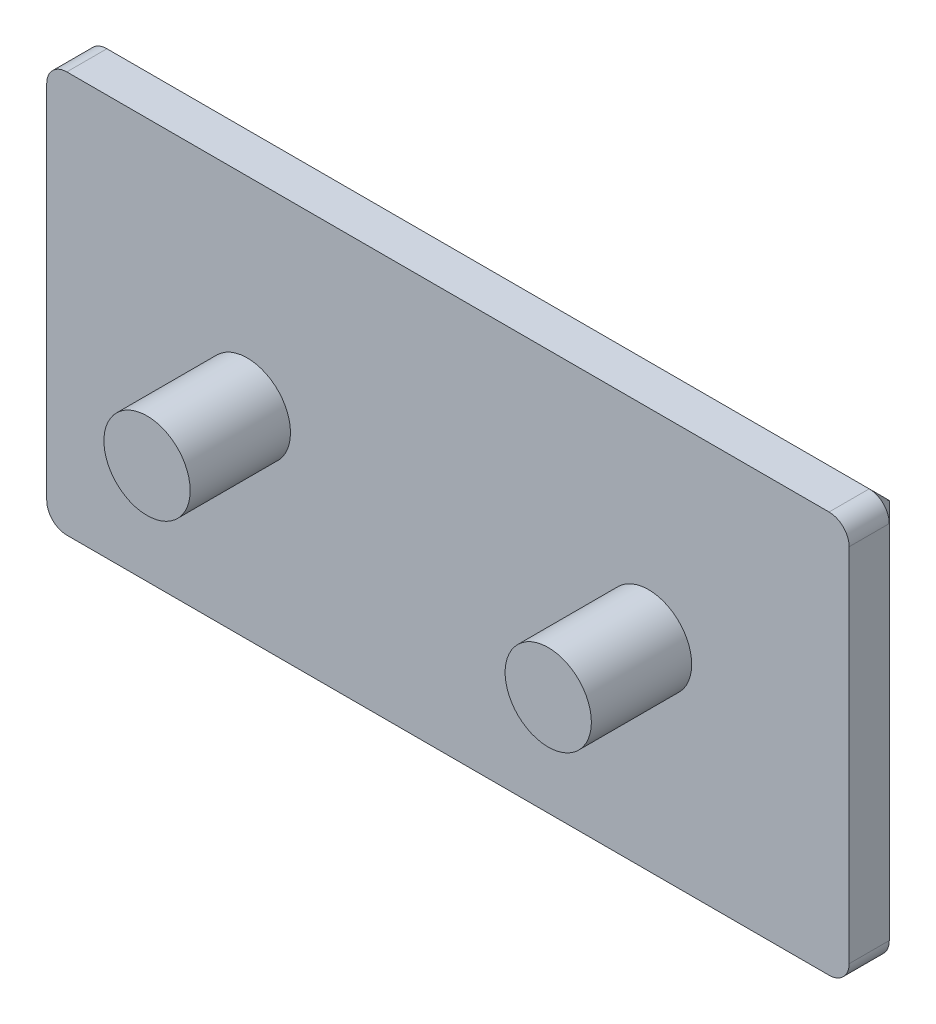
ISO-10303-21;
HEADER;
FILE_DESCRIPTION(('STEP AP214'),'2;1');
FILE_NAME('part.step','',(''),(''),'','','');
FILE_SCHEMA(('AUTOMOTIVE_DESIGN { 1 0 10303 214 1 1 1 1 }'));
ENDSEC;
DATA;
#1=APPLICATION_CONTEXT('core data for automotive mechanical design processes');
#2=APPLICATION_PROTOCOL_DEFINITION('international standard','automotive_design',2000,#1);
#3=PRODUCT_CONTEXT('',#1,'mechanical');
#4=PRODUCT('Part','Part','',(#3));
#5=PRODUCT_RELATED_PRODUCT_CATEGORY('part','',(#4));
#6=PRODUCT_DEFINITION_FORMATION('','',#4);
#7=PRODUCT_DEFINITION_CONTEXT('part definition',#1,'design');
#8=PRODUCT_DEFINITION('design','',#6,#7);
#9=PRODUCT_DEFINITION_SHAPE('','',#8);
#10=(LENGTH_UNIT() NAMED_UNIT(*) SI_UNIT(.MILLI.,.METRE.));
#11=(NAMED_UNIT(*) PLANE_ANGLE_UNIT() SI_UNIT($,.RADIAN.));
#12=(NAMED_UNIT(*) SI_UNIT($,.STERADIAN.) SOLID_ANGLE_UNIT());
#13=UNCERTAINTY_MEASURE_WITH_UNIT(LENGTH_MEASURE(1.E-05),#10,'distance_accuracy_value','');
#14=(GEOMETRIC_REPRESENTATION_CONTEXT(3) GLOBAL_UNCERTAINTY_ASSIGNED_CONTEXT((#13)) GLOBAL_UNIT_ASSIGNED_CONTEXT((#10,
#11,#12)) REPRESENTATION_CONTEXT('',''));
#15=CARTESIAN_POINT('',(0.,0.,0.));
#16=DIRECTION('',(0.,0.,1.));
#17=DIRECTION('',(1.,0.,0.));
#18=AXIS2_PLACEMENT_3D('',#15,#16,#17);
#19=CARTESIAN_POINT('',(20.,10.,3.));
#20=DIRECTION('',(-1.,0.,0.));
#21=DIRECTION('',(0.,0.,1.));
#22=AXIS2_PLACEMENT_3D('',#19,#20,#21);
#23=PLANE('',#22);
#24=DIRECTION('',(0.,0.,-1.));
#25=VECTOR('',#24,1.);
#26=CARTESIAN_POINT('',(20.,-9.,3.));
#27=LINE('',#26,#25);
#28=CARTESIAN_POINT('',(20.,-9.,3.));
#29=VERTEX_POINT('',#28);
#30=CARTESIAN_POINT('',(20.,-9.,1.00000000000001));
#31=VERTEX_POINT('',#30);
#32=EDGE_CURVE('E135',#29,#31,#27,.T.);
#33=ORIENTED_EDGE('',*,*,#32,.T.);
#34=DIRECTION('',(0.,1.,0.));
#35=VECTOR('',#34,1.);
#36=CARTESIAN_POINT('',(20.,10.,1.00000000000001));
#37=LINE('',#36,#35);
#38=CARTESIAN_POINT('',(20.,9.,1.00000000000001));
#39=VERTEX_POINT('',#38);
#40=EDGE_CURVE('E11',#31,#39,#37,.T.);
#41=ORIENTED_EDGE('',*,*,#40,.T.);
#42=DIRECTION('',(0.,0.,-1.));
#43=VECTOR('',#42,1.);
#44=CARTESIAN_POINT('',(20.,9.,3.));
#45=LINE('',#44,#43);
#46=CARTESIAN_POINT('',(20.,9.,3.));
#47=VERTEX_POINT('',#46);
#48=EDGE_CURVE('E138',#39,#47,#45,.F.);
#49=ORIENTED_EDGE('',*,*,#48,.T.);
#50=DIRECTION('',(0.,1.,0.));
#51=VECTOR('',#50,1.);
#52=CARTESIAN_POINT('',(20.,10.,3.));
#53=LINE('',#52,#51);
#54=EDGE_CURVE('E126',#29,#47,#53,.T.);
#55=ORIENTED_EDGE('',*,*,#54,.F.);
#56=EDGE_LOOP('',(#33,#41,#49,#55));
#57=FACE_BOUND('',#56,.T.);
#58=ADVANCED_FACE('F41',(#57),#23,.F.);
#59=CARTESIAN_POINT('',(-20.,10.,3.));
#60=DIRECTION('',(0.,-1.,0.));
#61=DIRECTION('',(0.,0.,-1.));
#62=AXIS2_PLACEMENT_3D('',#59,#60,#61);
#63=PLANE('',#62);
#64=DIRECTION('',(0.,0.,-1.));
#65=VECTOR('',#64,1.);
#66=CARTESIAN_POINT('',(19.,10.,3.));
#67=LINE('',#66,#65);
#68=CARTESIAN_POINT('',(19.,10.,3.));
#69=VERTEX_POINT('',#68);
#70=CARTESIAN_POINT('',(19.,10.,1.00000000000001));
#71=VERTEX_POINT('',#70);
#72=EDGE_CURVE('E173',#69,#71,#67,.T.);
#73=ORIENTED_EDGE('',*,*,#72,.T.);
#74=DIRECTION('',(-1.,0.,0.));
#75=VECTOR('',#74,1.);
#76=CARTESIAN_POINT('',(-20.,10.,1.00000000000001));
#77=LINE('',#76,#75);
#78=CARTESIAN_POINT('',(-19.,10.,1.00000000000001));
#79=VERTEX_POINT('',#78);
#80=EDGE_CURVE('E181',#71,#79,#77,.T.);
#81=ORIENTED_EDGE('',*,*,#80,.T.);
#82=DIRECTION('',(0.,0.,-1.));
#83=VECTOR('',#82,1.);
#84=CARTESIAN_POINT('',(-19.,10.,3.));
#85=LINE('',#84,#83);
#86=CARTESIAN_POINT('',(-19.,10.,3.));
#87=VERTEX_POINT('',#86);
#88=EDGE_CURVE('E170',#79,#87,#85,.F.);
#89=ORIENTED_EDGE('',*,*,#88,.T.);
#90=DIRECTION('',(-1.,0.,0.));
#91=VECTOR('',#90,1.);
#92=CARTESIAN_POINT('',(-20.,10.,3.));
#93=LINE('',#92,#91);
#94=EDGE_CURVE('E140',#69,#87,#93,.T.);
#95=ORIENTED_EDGE('',*,*,#94,.F.);
#96=EDGE_LOOP('',(#73,#81,#89,#95));
#97=FACE_BOUND('',#96,.T.);
#98=ADVANCED_FACE('F303',(#97),#63,.F.);
#99=CARTESIAN_POINT('',(-20.,10.,3.));
#100=DIRECTION('',(1.,0.,0.));
#101=DIRECTION('',(0.,1.,0.));
#102=AXIS2_PLACEMENT_3D('',#99,#100,#101);
#103=PLANE('',#102);
#104=DIRECTION('',(0.,0.,-1.));
#105=VECTOR('',#104,1.);
#106=CARTESIAN_POINT('',(-20.,9.,3.));
#107=LINE('',#106,#105);
#108=CARTESIAN_POINT('',(-20.,9.,3.));
#109=VERTEX_POINT('',#108);
#110=CARTESIAN_POINT('',(-20.,9.,1.00000000000001));
#111=VERTEX_POINT('',#110);
#112=EDGE_CURVE('E131',#109,#111,#107,.T.);
#113=ORIENTED_EDGE('',*,*,#112,.T.);
#114=DIRECTION('',(0.,-1.,0.));
#115=VECTOR('',#114,1.);
#116=CARTESIAN_POINT('',(-20.,10.,1.00000000000001));
#117=LINE('',#116,#115);
#118=CARTESIAN_POINT('',(-20.,-9.,1.00000000000001));
#119=VERTEX_POINT('',#118);
#120=EDGE_CURVE('E200',#111,#119,#117,.T.);
#121=ORIENTED_EDGE('',*,*,#120,.T.);
#122=DIRECTION('',(0.,0.,-1.));
#123=VECTOR('',#122,1.);
#124=CARTESIAN_POINT('',(-20.,-9.,3.));
#125=LINE('',#124,#123);
#126=CARTESIAN_POINT('',(-20.,-9.,3.));
#127=VERTEX_POINT('',#126);
#128=EDGE_CURVE('E167',#119,#127,#125,.F.);
#129=ORIENTED_EDGE('',*,*,#128,.T.);
#130=DIRECTION('',(0.,-1.,0.));
#131=VECTOR('',#130,1.);
#132=CARTESIAN_POINT('',(-20.,10.,3.));
#133=LINE('',#132,#131);
#134=EDGE_CURVE('E264',#109,#127,#133,.T.);
#135=ORIENTED_EDGE('',*,*,#134,.F.);
#136=EDGE_LOOP('',(#113,#121,#129,#135));
#137=FACE_BOUND('',#136,.T.);
#138=ADVANCED_FACE('F312',(#137),#103,.F.);
#139=CARTESIAN_POINT('',(-20.,-10.,3.));
#140=DIRECTION('',(0.,1.,0.));
#141=DIRECTION('',(0.,0.,1.));
#142=AXIS2_PLACEMENT_3D('',#139,#140,#141);
#143=PLANE('',#142);
#144=DIRECTION('',(0.,0.,-1.));
#145=VECTOR('',#144,1.);
#146=CARTESIAN_POINT('',(-19.,-10.,3.));
#147=LINE('',#146,#145);
#148=CARTESIAN_POINT('',(-19.,-10.,3.));
#149=VERTEX_POINT('',#148);
#150=CARTESIAN_POINT('',(-19.,-10.,1.00000000000001));
#151=VERTEX_POINT('',#150);
#152=EDGE_CURVE('E145',#149,#151,#147,.T.);
#153=ORIENTED_EDGE('',*,*,#152,.T.);
#154=DIRECTION('',(1.,0.,0.));
#155=VECTOR('',#154,1.);
#156=CARTESIAN_POINT('',(-20.,-10.,1.00000000000001));
#157=LINE('',#156,#155);
#158=CARTESIAN_POINT('',(19.,-10.,1.00000000000001));
#159=VERTEX_POINT('',#158);
#160=EDGE_CURVE('E67',#151,#159,#157,.T.);
#161=ORIENTED_EDGE('',*,*,#160,.T.);
#162=DIRECTION('',(0.,0.,-1.));
#163=VECTOR('',#162,1.);
#164=CARTESIAN_POINT('',(19.,-10.,3.));
#165=LINE('',#164,#163);
#166=CARTESIAN_POINT('',(19.,-10.,3.));
#167=VERTEX_POINT('',#166);
#168=EDGE_CURVE('E149',#159,#167,#165,.F.);
#169=ORIENTED_EDGE('',*,*,#168,.T.);
#170=DIRECTION('',(1.,0.,0.));
#171=VECTOR('',#170,1.);
#172=CARTESIAN_POINT('',(-20.,-10.,3.));
#173=LINE('',#172,#171);
#174=EDGE_CURVE('E129',#149,#167,#173,.T.);
#175=ORIENTED_EDGE('',*,*,#174,.F.);
#176=EDGE_LOOP('',(#153,#161,#169,#175));
#177=FACE_BOUND('',#176,.T.);
#178=ADVANCED_FACE('F278',(#177),#143,.F.);
#179=CARTESIAN_POINT('',(0.,0.,3.));
#180=DIRECTION('',(0.,0.,1.));
#181=DIRECTION('',(1.,0.,0.));
#182=AXIS2_PLACEMENT_3D('',#179,#180,#181);
#183=PLANE('',#182);
#184=CARTESIAN_POINT('',(-10.,0.,3.));
#185=DIRECTION('',(0.,0.,1.));
#186=DIRECTION('',(1.,0.,0.));
#187=AXIS2_PLACEMENT_3D('',#184,#185,#186);
#188=CIRCLE('',#187,2.15);
#189=CARTESIAN_POINT('',(-7.85,0.,3.));
#190=VERTEX_POINT('',#189);
#191=EDGE_CURVE('E240',#190,#190,#188,.T.);
#192=ORIENTED_EDGE('',*,*,#191,.F.);
#193=EDGE_LOOP('',(#192));
#194=FACE_BOUND('',#193,.T.);
#195=CARTESIAN_POINT('',(10.,0.,3.));
#196=DIRECTION('',(0.,0.,1.));
#197=DIRECTION('',(1.,0.,0.));
#198=AXIS2_PLACEMENT_3D('',#195,#196,#197);
#199=CIRCLE('',#198,2.15);
#200=CARTESIAN_POINT('',(12.15,0.,3.));
#201=VERTEX_POINT('',#200);
#202=EDGE_CURVE('E252',#201,#201,#199,.T.);
#203=ORIENTED_EDGE('',*,*,#202,.F.);
#204=EDGE_LOOP('',(#203));
#205=FACE_BOUND('',#204,.T.);
#206=ORIENTED_EDGE('',*,*,#174,.T.);
#207=CARTESIAN_POINT('',(19.,-9.,3.));
#208=DIRECTION('',(0.,0.,1.));
#209=DIRECTION('',(1.,0.,0.));
#210=AXIS2_PLACEMENT_3D('',#207,#208,#209);
#211=CIRCLE('',#210,1.);
#212=EDGE_CURVE('E123',#167,#29,#211,.T.);
#213=ORIENTED_EDGE('',*,*,#212,.T.);
#214=ORIENTED_EDGE('',*,*,#54,.T.);
#215=CARTESIAN_POINT('',(19.,9.,3.));
#216=DIRECTION('',(0.,0.,1.));
#217=DIRECTION('',(1.,0.,0.));
#218=AXIS2_PLACEMENT_3D('',#215,#216,#217);
#219=CIRCLE('',#218,1.);
#220=EDGE_CURVE('E159',#47,#69,#219,.T.);
#221=ORIENTED_EDGE('',*,*,#220,.T.);
#222=ORIENTED_EDGE('',*,*,#94,.T.);
#223=CARTESIAN_POINT('',(-19.,9.,3.));
#224=DIRECTION('',(0.,0.,1.));
#225=DIRECTION('',(1.,0.,0.));
#226=AXIS2_PLACEMENT_3D('',#223,#224,#225);
#227=CIRCLE('',#226,1.);
#228=EDGE_CURVE('E156',#87,#109,#227,.T.);
#229=ORIENTED_EDGE('',*,*,#228,.T.);
#230=ORIENTED_EDGE('',*,*,#134,.T.);
#231=CARTESIAN_POINT('',(-19.,-9.,3.));
#232=DIRECTION('',(0.,0.,1.));
#233=DIRECTION('',(1.,0.,0.));
#234=AXIS2_PLACEMENT_3D('',#231,#232,#233);
#235=CIRCLE('',#234,1.);
#236=EDGE_CURVE('E132',#127,#149,#235,.T.);
#237=ORIENTED_EDGE('',*,*,#236,.T.);
#238=EDGE_LOOP('',(#206,#213,#214,#221,#222,#229,#230,#237));
#239=FACE_BOUND('',#238,.T.);
#240=ADVANCED_FACE('F125',(#194,#205,#239),#183,.T.);
#241=CARTESIAN_POINT('',(0.,0.,0.));
#242=DIRECTION('',(0.,0.,1.));
#243=DIRECTION('',(1.,0.,0.));
#244=AXIS2_PLACEMENT_3D('',#241,#242,#243);
#245=PLANE('',#244);
#246=DIRECTION('',(0.,1.,0.));
#247=VECTOR('',#246,1.);
#248=CARTESIAN_POINT('',(-19.,0.,0.));
#249=LINE('',#248,#247);
#250=CARTESIAN_POINT('',(-19.,-8.99999999999999,0.));
#251=VERTEX_POINT('',#250);
#252=CARTESIAN_POINT('',(-19.,9.,0.));
#253=VERTEX_POINT('',#252);
#254=EDGE_CURVE('E190',#251,#253,#249,.T.);
#255=ORIENTED_EDGE('',*,*,#254,.T.);
#256=DIRECTION('',(1.,0.,0.));
#257=VECTOR('',#256,1.);
#258=CARTESIAN_POINT('',(0.,8.99999999999999,0.));
#259=LINE('',#258,#257);
#260=CARTESIAN_POINT('',(19.,9.,0.));
#261=VERTEX_POINT('',#260);
#262=EDGE_CURVE('E193',#253,#261,#259,.T.);
#263=ORIENTED_EDGE('',*,*,#262,.T.);
#264=DIRECTION('',(0.,-1.,0.));
#265=VECTOR('',#264,1.);
#266=CARTESIAN_POINT('',(19.,0.,0.));
#267=LINE('',#266,#265);
#268=CARTESIAN_POINT('',(19.,-9.,0.));
#269=VERTEX_POINT('',#268);
#270=EDGE_CURVE('E184',#261,#269,#267,.T.);
#271=ORIENTED_EDGE('',*,*,#270,.T.);
#272=DIRECTION('',(-1.,0.,0.));
#273=VECTOR('',#272,1.);
#274=CARTESIAN_POINT('',(0.,-8.99999999999999,0.));
#275=LINE('',#274,#273);
#276=EDGE_CURVE('E187',#269,#251,#275,.T.);
#277=ORIENTED_EDGE('',*,*,#276,.T.);
#278=EDGE_LOOP('',(#255,#263,#271,#277));
#279=FACE_BOUND('',#278,.T.);
#280=ADVANCED_FACE('F421',(#279),#245,.F.);
#281=CARTESIAN_POINT('',(10.,0.,8.));
#282=DIRECTION('',(0.,0.,-1.));
#283=DIRECTION('',(-1.,0.,0.));
#284=AXIS2_PLACEMENT_3D('',#281,#282,#283);
#285=CYLINDRICAL_SURFACE('',#284,2.15);
#286=CARTESIAN_POINT('',(10.,0.,8.));
#287=DIRECTION('',(0.,0.,1.));
#288=DIRECTION('',(1.,0.,0.));
#289=AXIS2_PLACEMENT_3D('',#286,#287,#288);
#290=CIRCLE('',#289,2.15);
#291=CARTESIAN_POINT('',(12.15,0.,8.));
#292=VERTEX_POINT('',#291);
#293=EDGE_CURVE('E141',#292,#292,#290,.T.);
#294=ORIENTED_EDGE('',*,*,#293,.F.);
#295=EDGE_LOOP('',(#294));
#296=FACE_BOUND('',#295,.T.);
#297=ORIENTED_EDGE('',*,*,#202,.T.);
#298=EDGE_LOOP('',(#297));
#299=FACE_BOUND('',#298,.T.);
#300=ADVANCED_FACE('F413',(#296,#299),#285,.T.);
#301=CARTESIAN_POINT('',(10.,0.,8.));
#302=DIRECTION('',(0.,0.,1.));
#303=DIRECTION('',(1.,0.,0.));
#304=AXIS2_PLACEMENT_3D('',#301,#302,#303);
#305=PLANE('',#304);
#306=ORIENTED_EDGE('',*,*,#293,.T.);
#307=EDGE_LOOP('',(#306));
#308=FACE_BOUND('',#307,.T.);
#309=ADVANCED_FACE('F405',(#308),#305,.T.);
#310=CARTESIAN_POINT('',(-10.,0.,8.));
#311=DIRECTION('',(0.,0.,-1.));
#312=DIRECTION('',(-1.,0.,0.));
#313=AXIS2_PLACEMENT_3D('',#310,#311,#312);
#314=CYLINDRICAL_SURFACE('',#313,2.15);
#315=CARTESIAN_POINT('',(-10.,0.,8.));
#316=DIRECTION('',(0.,0.,1.));
#317=DIRECTION('',(1.,0.,0.));
#318=AXIS2_PLACEMENT_3D('',#315,#316,#317);
#319=CIRCLE('',#318,2.15);
#320=CARTESIAN_POINT('',(-7.85,0.,8.));
#321=VERTEX_POINT('',#320);
#322=EDGE_CURVE('E246',#321,#321,#319,.T.);
#323=ORIENTED_EDGE('',*,*,#322,.F.);
#324=EDGE_LOOP('',(#323));
#325=FACE_BOUND('',#324,.T.);
#326=ORIENTED_EDGE('',*,*,#191,.T.);
#327=EDGE_LOOP('',(#326));
#328=FACE_BOUND('',#327,.T.);
#329=ADVANCED_FACE('F396',(#325,#328),#314,.T.);
#330=CARTESIAN_POINT('',(-10.,0.,8.));
#331=DIRECTION('',(0.,0.,1.));
#332=DIRECTION('',(1.,0.,0.));
#333=AXIS2_PLACEMENT_3D('',#330,#331,#332);
#334=PLANE('',#333);
#335=ORIENTED_EDGE('',*,*,#322,.T.);
#336=EDGE_LOOP('',(#335));
#337=FACE_BOUND('',#336,.T.);
#338=ADVANCED_FACE('F328',(#337),#334,.T.);
#339=CARTESIAN_POINT('',(19.,-9.,3.));
#340=DIRECTION('',(0.,0.,-1.));
#341=DIRECTION('',(-1.,0.,0.));
#342=AXIS2_PLACEMENT_3D('',#339,#340,#341);
#343=CYLINDRICAL_SURFACE('',#342,1.);
#344=ORIENTED_EDGE('',*,*,#168,.F.);
#345=CARTESIAN_POINT('',(19.,-9.,1.00000000000001));
#346=DIRECTION('',(0.,0.,1.));
#347=DIRECTION('',(1.,0.,0.));
#348=AXIS2_PLACEMENT_3D('',#345,#346,#347);
#349=CIRCLE('',#348,1.);
#350=EDGE_CURVE('E52',#159,#31,#349,.T.);
#351=ORIENTED_EDGE('',*,*,#350,.T.);
#352=ORIENTED_EDGE('',*,*,#32,.F.);
#353=ORIENTED_EDGE('',*,*,#212,.F.);
#354=EDGE_LOOP('',(#344,#351,#352,#353));
#355=FACE_BOUND('',#354,.T.);
#356=ADVANCED_FACE('F143',(#355),#343,.T.);
#357=CARTESIAN_POINT('',(-19.,-9.,3.));
#358=DIRECTION('',(0.,0.,-1.));
#359=DIRECTION('',(-1.,0.,0.));
#360=AXIS2_PLACEMENT_3D('',#357,#358,#359);
#361=CYLINDRICAL_SURFACE('',#360,1.);
#362=ORIENTED_EDGE('',*,*,#128,.F.);
#363=CARTESIAN_POINT('',(-19.,-9.,1.00000000000001));
#364=DIRECTION('',(0.,0.,1.));
#365=DIRECTION('',(1.,0.,0.));
#366=AXIS2_PLACEMENT_3D('',#363,#364,#365);
#367=CIRCLE('',#366,1.);
#368=EDGE_CURVE('E203',#119,#151,#367,.T.);
#369=ORIENTED_EDGE('',*,*,#368,.T.);
#370=ORIENTED_EDGE('',*,*,#152,.F.);
#371=ORIENTED_EDGE('',*,*,#236,.F.);
#372=EDGE_LOOP('',(#362,#369,#370,#371));
#373=FACE_BOUND('',#372,.T.);
#374=ADVANCED_FACE('F276',(#373),#361,.T.);
#375=CARTESIAN_POINT('',(19.,9.,3.));
#376=DIRECTION('',(0.,0.,-1.));
#377=DIRECTION('',(-1.,0.,0.));
#378=AXIS2_PLACEMENT_3D('',#375,#376,#377);
#379=CYLINDRICAL_SURFACE('',#378,1.);
#380=ORIENTED_EDGE('',*,*,#48,.F.);
#381=CARTESIAN_POINT('',(19.,9.,1.00000000000001));
#382=DIRECTION('',(0.,0.,1.));
#383=DIRECTION('',(1.,0.,0.));
#384=AXIS2_PLACEMENT_3D('',#381,#382,#383);
#385=CIRCLE('',#384,1.);
#386=EDGE_CURVE('E177',#39,#71,#385,.T.);
#387=ORIENTED_EDGE('',*,*,#386,.T.);
#388=ORIENTED_EDGE('',*,*,#72,.F.);
#389=ORIENTED_EDGE('',*,*,#220,.F.);
#390=EDGE_LOOP('',(#380,#387,#388,#389));
#391=FACE_BOUND('',#390,.T.);
#392=ADVANCED_FACE('F291',(#391),#379,.T.);
#393=CARTESIAN_POINT('',(-19.,9.,3.));
#394=DIRECTION('',(0.,0.,-1.));
#395=DIRECTION('',(-1.,0.,0.));
#396=AXIS2_PLACEMENT_3D('',#393,#394,#395);
#397=CYLINDRICAL_SURFACE('',#396,1.);
#398=ORIENTED_EDGE('',*,*,#88,.F.);
#399=CARTESIAN_POINT('',(-19.,9.,1.00000000000001));
#400=DIRECTION('',(0.,0.,1.));
#401=DIRECTION('',(1.,0.,0.));
#402=AXIS2_PLACEMENT_3D('',#399,#400,#401);
#403=CIRCLE('',#402,1.);
#404=EDGE_CURVE('E197',#79,#111,#403,.T.);
#405=ORIENTED_EDGE('',*,*,#404,.T.);
#406=ORIENTED_EDGE('',*,*,#112,.F.);
#407=ORIENTED_EDGE('',*,*,#228,.F.);
#408=EDGE_LOOP('',(#398,#405,#406,#407));
#409=FACE_BOUND('',#408,.T.);
#410=ADVANCED_FACE('F307',(#409),#397,.T.);
#411=CARTESIAN_POINT('',(-19.,-9.,1.00000000000001));
#412=DIRECTION('',(0.,0.,1.));
#413=DIRECTION('',(1.,0.,0.));
#414=AXIS2_PLACEMENT_3D('',#411,#412,#413);
#415=CONICAL_SURFACE('',#414,1.00000000000001,0.785398163397448);
#416=DIRECTION('',(0.,0.707106781186547,-0.707106781186547));
#417=VECTOR('',#416,1.);
#418=CARTESIAN_POINT('',(-19.,-10.,1.00000000000001));
#419=LINE('',#418,#417);
#420=EDGE_CURVE('E231',#151,#251,#419,.T.);
#421=ORIENTED_EDGE('',*,*,#420,.F.);
#422=ORIENTED_EDGE('',*,*,#368,.F.);
#423=DIRECTION('',(-0.707106781186547,0.,0.707106781186547));
#424=VECTOR('',#423,1.);
#425=CARTESIAN_POINT('',(-19.,-9.,0.));
#426=LINE('',#425,#424);
#427=EDGE_CURVE('E46',#251,#119,#426,.T.);
#428=ORIENTED_EDGE('',*,*,#427,.F.);
#429=EDGE_LOOP('',(#421,#422,#428));
#430=FACE_BOUND('',#429,.T.);
#431=ADVANCED_FACE('F44',(#430),#415,.T.);
#432=CARTESIAN_POINT('',(-20.,10.,1.00000000000001));
#433=DIRECTION('',(0.707106781186548,0.,0.707106781186547));
#434=DIRECTION('',(0.,-1.,0.));
#435=AXIS2_PLACEMENT_3D('',#432,#433,#434);
#436=PLANE('',#435);
#437=ORIENTED_EDGE('',*,*,#427,.T.);
#438=ORIENTED_EDGE('',*,*,#120,.F.);
#439=DIRECTION('',(-0.707106781186547,0.,0.707106781186547));
#440=VECTOR('',#439,1.);
#441=CARTESIAN_POINT('',(-19.,9.,0.));
#442=LINE('',#441,#440);
#443=EDGE_CURVE('E228',#253,#111,#442,.T.);
#444=ORIENTED_EDGE('',*,*,#443,.F.);
#445=ORIENTED_EDGE('',*,*,#254,.F.);
#446=EDGE_LOOP('',(#437,#438,#444,#445));
#447=FACE_BOUND('',#446,.T.);
#448=ADVANCED_FACE('F311',(#447),#436,.F.);
#449=CARTESIAN_POINT('',(-20.,-10.,1.00000000000001));
#450=DIRECTION('',(0.,0.707106781186547,0.707106781186547));
#451=DIRECTION('',(1.,0.,0.));
#452=AXIS2_PLACEMENT_3D('',#449,#450,#451);
#453=PLANE('',#452);
#454=ORIENTED_EDGE('',*,*,#420,.T.);
#455=ORIENTED_EDGE('',*,*,#276,.F.);
#456=DIRECTION('',(0.,0.707106781186547,-0.707106781186547));
#457=VECTOR('',#456,1.);
#458=CARTESIAN_POINT('',(19.,-10.,1.00000000000001));
#459=LINE('',#458,#457);
#460=EDGE_CURVE('E224',#159,#269,#459,.T.);
#461=ORIENTED_EDGE('',*,*,#460,.F.);
#462=ORIENTED_EDGE('',*,*,#160,.F.);
#463=EDGE_LOOP('',(#454,#455,#461,#462));
#464=FACE_BOUND('',#463,.T.);
#465=ADVANCED_FACE('F281',(#464),#453,.F.);
#466=CARTESIAN_POINT('',(-19.,9.,1.00000000000001));
#467=DIRECTION('',(0.,0.,1.));
#468=DIRECTION('',(1.,0.,0.));
#469=AXIS2_PLACEMENT_3D('',#466,#467,#468);
#470=CONICAL_SURFACE('',#469,1.00000000000001,0.785398163397448);
#471=ORIENTED_EDGE('',*,*,#443,.T.);
#472=ORIENTED_EDGE('',*,*,#404,.F.);
#473=DIRECTION('',(0.,0.707106781186547,0.707106781186547));
#474=VECTOR('',#473,1.);
#475=CARTESIAN_POINT('',(-19.,8.99999999999999,0.));
#476=LINE('',#475,#474);
#477=EDGE_CURVE('E220',#253,#79,#476,.T.);
#478=ORIENTED_EDGE('',*,*,#477,.F.);
#479=EDGE_LOOP('',(#471,#472,#478));
#480=FACE_BOUND('',#479,.T.);
#481=ADVANCED_FACE('F309',(#480),#470,.T.);
#482=CARTESIAN_POINT('',(19.,-9.,1.00000000000001));
#483=DIRECTION('',(0.,0.,1.));
#484=DIRECTION('',(1.,0.,0.));
#485=AXIS2_PLACEMENT_3D('',#482,#483,#484);
#486=CONICAL_SURFACE('',#485,1.00000000000001,0.785398163397448);
#487=ORIENTED_EDGE('',*,*,#350,.F.);
#488=ORIENTED_EDGE('',*,*,#460,.T.);
#489=DIRECTION('',(-0.707106781186547,0.,-0.707106781186547));
#490=VECTOR('',#489,1.);
#491=CARTESIAN_POINT('',(20.,-9.,1.00000000000001));
#492=LINE('',#491,#490);
#493=EDGE_CURVE('E216',#31,#269,#492,.T.);
#494=ORIENTED_EDGE('',*,*,#493,.F.);
#495=EDGE_LOOP('',(#487,#488,#494));
#496=FACE_BOUND('',#495,.T.);
#497=ADVANCED_FACE('F283',(#496),#486,.T.);
#498=CARTESIAN_POINT('',(-20.,10.,1.00000000000001));
#499=DIRECTION('',(0.,-0.707106781186547,0.707106781186547));
#500=DIRECTION('',(-1.,0.,0.));
#501=AXIS2_PLACEMENT_3D('',#498,#499,#500);
#502=PLANE('',#501);
#503=ORIENTED_EDGE('',*,*,#477,.T.);
#504=ORIENTED_EDGE('',*,*,#80,.F.);
#505=DIRECTION('',(0.,0.707106781186547,0.707106781186547));
#506=VECTOR('',#505,1.);
#507=CARTESIAN_POINT('',(19.,8.99999999999999,0.));
#508=LINE('',#507,#506);
#509=EDGE_CURVE('E213',#261,#71,#508,.T.);
#510=ORIENTED_EDGE('',*,*,#509,.F.);
#511=ORIENTED_EDGE('',*,*,#262,.F.);
#512=EDGE_LOOP('',(#503,#504,#510,#511));
#513=FACE_BOUND('',#512,.T.);
#514=ADVANCED_FACE('F299',(#513),#502,.F.);
#515=CARTESIAN_POINT('',(20.,10.,1.00000000000001));
#516=DIRECTION('',(-0.707106781186547,0.,0.707106781186547));
#517=DIRECTION('',(0.,1.,0.));
#518=AXIS2_PLACEMENT_3D('',#515,#516,#517);
#519=PLANE('',#518);
#520=ORIENTED_EDGE('',*,*,#493,.T.);
#521=ORIENTED_EDGE('',*,*,#270,.F.);
#522=DIRECTION('',(-0.707106781186547,0.,-0.707106781186547));
#523=VECTOR('',#522,1.);
#524=CARTESIAN_POINT('',(20.,9.,1.00000000000001));
#525=LINE('',#524,#523);
#526=EDGE_CURVE('E210',#39,#261,#525,.T.);
#527=ORIENTED_EDGE('',*,*,#526,.F.);
#528=ORIENTED_EDGE('',*,*,#40,.F.);
#529=EDGE_LOOP('',(#520,#521,#527,#528));
#530=FACE_BOUND('',#529,.T.);
#531=ADVANCED_FACE('F288',(#530),#519,.F.);
#532=CARTESIAN_POINT('',(19.,9.,1.00000000000001));
#533=DIRECTION('',(0.,0.,1.));
#534=DIRECTION('',(1.,0.,0.));
#535=AXIS2_PLACEMENT_3D('',#532,#533,#534);
#536=CONICAL_SURFACE('',#535,1.00000000000001,0.785398163397448);
#537=ORIENTED_EDGE('',*,*,#509,.T.);
#538=ORIENTED_EDGE('',*,*,#386,.F.);
#539=ORIENTED_EDGE('',*,*,#526,.T.);
#540=EDGE_LOOP('',(#537,#538,#539));
#541=FACE_BOUND('',#540,.T.);
#542=ADVANCED_FACE('F294',(#541),#536,.T.);
#543=CLOSED_SHELL('',(#58,#98,#138,#178,#240,#280,#300,#309,#329,#338,#356,#374,#392,#410,#431,
#448,#465,#481,#497,#514,#531,#542));
#544=MANIFOLD_SOLID_BREP('B2',#543);
#545=ADVANCED_BREP_SHAPE_REPRESENTATION('',(#18,#544),#14);
#546=SHAPE_DEFINITION_REPRESENTATION(#9,#545);
ENDSEC;
END-ISO-10303-21;
